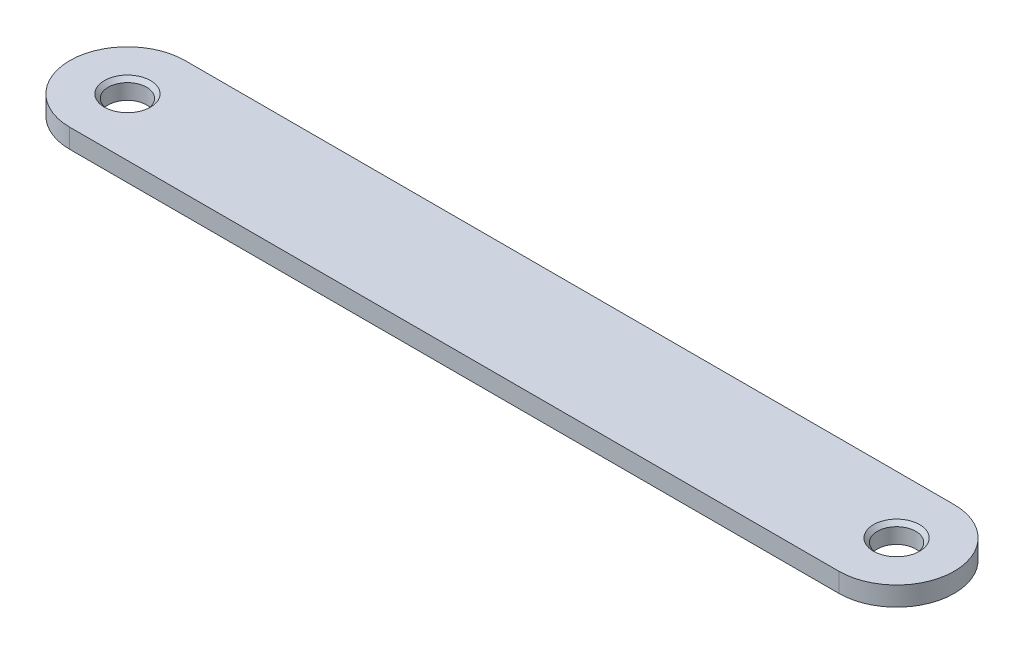
ISO-10303-21;
HEADER;
FILE_DESCRIPTION(('STEP AP214'),'2;1');
FILE_NAME('part.step','',(''),(''),'','','');
FILE_SCHEMA(('AUTOMOTIVE_DESIGN { 1 0 10303 214 1 1 1 1 }'));
ENDSEC;
DATA;
#1=APPLICATION_CONTEXT('core data for automotive mechanical design processes');
#2=APPLICATION_PROTOCOL_DEFINITION('international standard','automotive_design',2000,#1);
#3=PRODUCT_CONTEXT('',#1,'mechanical');
#4=PRODUCT('Part','Part','',(#3));
#5=PRODUCT_RELATED_PRODUCT_CATEGORY('part','',(#4));
#6=PRODUCT_DEFINITION_FORMATION('','',#4);
#7=PRODUCT_DEFINITION_CONTEXT('part definition',#1,'design');
#8=PRODUCT_DEFINITION('design','',#6,#7);
#9=PRODUCT_DEFINITION_SHAPE('','',#8);
#10=(LENGTH_UNIT() NAMED_UNIT(*) SI_UNIT(.MILLI.,.METRE.));
#11=(NAMED_UNIT(*) PLANE_ANGLE_UNIT() SI_UNIT($,.RADIAN.));
#12=(NAMED_UNIT(*) SI_UNIT($,.STERADIAN.) SOLID_ANGLE_UNIT());
#13=UNCERTAINTY_MEASURE_WITH_UNIT(LENGTH_MEASURE(1.E-05),#10,'distance_accuracy_value','');
#14=(GEOMETRIC_REPRESENTATION_CONTEXT(3) GLOBAL_UNCERTAINTY_ASSIGNED_CONTEXT((#13)) GLOBAL_UNIT_ASSIGNED_CONTEXT((#10,
#11,#12)) REPRESENTATION_CONTEXT('',''));
#15=CARTESIAN_POINT('',(0.,0.,0.));
#16=DIRECTION('',(0.,0.,1.));
#17=DIRECTION('',(1.,0.,0.));
#18=AXIS2_PLACEMENT_3D('',#15,#16,#17);
#19=CARTESIAN_POINT('',(0.,5.,0.));
#20=DIRECTION('',(0.,1.,0.));
#21=DIRECTION('',(0.,0.,1.));
#22=AXIS2_PLACEMENT_3D('',#19,#20,#21);
#23=PLANE('',#22);
#24=CARTESIAN_POINT('',(0.,5.,0.));
#25=DIRECTION('',(0.,1.,0.));
#26=DIRECTION('',(0.,0.,1.));
#27=AXIS2_PLACEMENT_3D('',#24,#25,#26);
#28=CIRCLE('',#27,6.00000000000003);
#29=CARTESIAN_POINT('',(0.,5.,6.00000000000003));
#30=VERTEX_POINT('',#29);
#31=EDGE_CURVE('E11',#30,#30,#28,.F.);
#32=ORIENTED_EDGE('',*,*,#31,.T.);
#33=EDGE_LOOP('',(#32));
#34=FACE_BOUND('',#33,.T.);
#35=CARTESIAN_POINT('',(200.,5.,0.));
#36=DIRECTION('',(0.,1.,0.));
#37=DIRECTION('',(0.,0.,1.));
#38=AXIS2_PLACEMENT_3D('',#35,#36,#37);
#39=CIRCLE('',#38,5.99999999999995);
#40=CARTESIAN_POINT('',(200.,5.,5.99999999999995));
#41=VERTEX_POINT('',#40);
#42=EDGE_CURVE('E121',#41,#41,#39,.F.);
#43=ORIENTED_EDGE('',*,*,#42,.T.);
#44=EDGE_LOOP('',(#43));
#45=FACE_BOUND('',#44,.T.);
#46=CARTESIAN_POINT('',(0.,5.,0.));
#47=DIRECTION('',(0.,1.,0.));
#48=DIRECTION('',(0.,0.,1.));
#49=AXIS2_PLACEMENT_3D('',#46,#47,#48);
#50=CIRCLE('',#49,15.);
#51=CARTESIAN_POINT('',(0.,5.,-15.));
#52=VERTEX_POINT('',#51);
#53=CARTESIAN_POINT('',(0.,5.,15.));
#54=VERTEX_POINT('',#53);
#55=EDGE_CURVE('E93',#52,#54,#50,.T.);
#56=ORIENTED_EDGE('',*,*,#55,.T.);
#57=DIRECTION('',(1.,0.,0.));
#58=VECTOR('',#57,1.);
#59=CARTESIAN_POINT('',(0.,5.,15.));
#60=LINE('',#59,#58);
#61=CARTESIAN_POINT('',(200.,5.,15.));
#62=VERTEX_POINT('',#61);
#63=EDGE_CURVE('E89',#54,#62,#60,.T.);
#64=ORIENTED_EDGE('',*,*,#63,.T.);
#65=CARTESIAN_POINT('',(200.,5.,0.));
#66=DIRECTION('',(0.,1.,0.));
#67=DIRECTION('',(0.,0.,1.));
#68=AXIS2_PLACEMENT_3D('',#65,#66,#67);
#69=CIRCLE('',#68,15.);
#70=CARTESIAN_POINT('',(200.,5.,-15.));
#71=VERTEX_POINT('',#70);
#72=EDGE_CURVE('E91',#62,#71,#69,.T.);
#73=ORIENTED_EDGE('',*,*,#72,.T.);
#74=DIRECTION('',(-1.,0.,0.));
#75=VECTOR('',#74,1.);
#76=CARTESIAN_POINT('',(0.,5.,-15.));
#77=LINE('',#76,#75);
#78=EDGE_CURVE('E58',#71,#52,#77,.T.);
#79=ORIENTED_EDGE('',*,*,#78,.T.);
#80=EDGE_LOOP('',(#56,#64,#73,#79));
#81=FACE_BOUND('',#80,.T.);
#82=ADVANCED_FACE('F41',(#34,#45,#81),#23,.T.);
#83=CARTESIAN_POINT('',(0.,0.,0.));
#84=DIRECTION('',(0.,1.,0.));
#85=DIRECTION('',(0.,0.,1.));
#86=AXIS2_PLACEMENT_3D('',#83,#84,#85);
#87=PLANE('',#86);
#88=CARTESIAN_POINT('',(0.,0.,0.));
#89=DIRECTION('',(0.,1.,0.));
#90=DIRECTION('',(0.,0.,1.));
#91=AXIS2_PLACEMENT_3D('',#88,#89,#90);
#92=CIRCLE('',#91,15.);
#93=CARTESIAN_POINT('',(0.,0.,-15.));
#94=VERTEX_POINT('',#93);
#95=CARTESIAN_POINT('',(0.,0.,15.));
#96=VERTEX_POINT('',#95);
#97=EDGE_CURVE('E108',#94,#96,#92,.T.);
#98=ORIENTED_EDGE('',*,*,#97,.F.);
#99=DIRECTION('',(-1.,0.,0.));
#100=VECTOR('',#99,1.);
#101=CARTESIAN_POINT('',(0.,0.,-15.));
#102=LINE('',#101,#100);
#103=CARTESIAN_POINT('',(200.,0.,-15.));
#104=VERTEX_POINT('',#103);
#105=EDGE_CURVE('E81',#104,#94,#102,.T.);
#106=ORIENTED_EDGE('',*,*,#105,.F.);
#107=CARTESIAN_POINT('',(200.,0.,0.));
#108=DIRECTION('',(0.,1.,0.));
#109=DIRECTION('',(0.,0.,1.));
#110=AXIS2_PLACEMENT_3D('',#107,#108,#109);
#111=CIRCLE('',#110,15.);
#112=CARTESIAN_POINT('',(200.,0.,15.));
#113=VERTEX_POINT('',#112);
#114=EDGE_CURVE('E75',#113,#104,#111,.T.);
#115=ORIENTED_EDGE('',*,*,#114,.F.);
#116=DIRECTION('',(1.,0.,0.));
#117=VECTOR('',#116,1.);
#118=CARTESIAN_POINT('',(0.,0.,15.));
#119=LINE('',#118,#117);
#120=EDGE_CURVE('E98',#96,#113,#119,.T.);
#121=ORIENTED_EDGE('',*,*,#120,.F.);
#122=EDGE_LOOP('',(#98,#106,#115,#121));
#123=FACE_BOUND('',#122,.T.);
#124=CARTESIAN_POINT('',(0.,0.,0.));
#125=DIRECTION('',(0.,1.,0.));
#126=DIRECTION('',(0.,0.,1.));
#127=AXIS2_PLACEMENT_3D('',#124,#125,#126);
#128=CIRCLE('',#127,5.);
#129=CARTESIAN_POINT('',(0.,0.,5.));
#130=VERTEX_POINT('',#129);
#131=EDGE_CURVE('E111',#130,#130,#128,.T.);
#132=ORIENTED_EDGE('',*,*,#131,.T.);
#133=EDGE_LOOP('',(#132));
#134=FACE_BOUND('',#133,.T.);
#135=CARTESIAN_POINT('',(200.,0.,0.));
#136=DIRECTION('',(0.,1.,0.));
#137=DIRECTION('',(0.,0.,1.));
#138=AXIS2_PLACEMENT_3D('',#135,#136,#137);
#139=CIRCLE('',#138,4.99999999999999);
#140=CARTESIAN_POINT('',(200.,0.,4.99999999999999));
#141=VERTEX_POINT('',#140);
#142=EDGE_CURVE('E171',#141,#141,#139,.T.);
#143=ORIENTED_EDGE('',*,*,#142,.T.);
#144=EDGE_LOOP('',(#143));
#145=FACE_BOUND('',#144,.T.);
#146=ADVANCED_FACE('F140',(#123,#134,#145),#87,.F.);
#147=CARTESIAN_POINT('',(0.,5.,0.));
#148=DIRECTION('',(0.,-1.,0.));
#149=DIRECTION('',(0.,0.,-1.));
#150=AXIS2_PLACEMENT_3D('',#147,#148,#149);
#151=CYLINDRICAL_SURFACE('',#150,15.);
#152=ORIENTED_EDGE('',*,*,#97,.T.);
#153=DIRECTION('',(0.,-1.,0.));
#154=VECTOR('',#153,1.);
#155=CARTESIAN_POINT('',(0.,5.,15.));
#156=LINE('',#155,#154);
#157=EDGE_CURVE('E99',#54,#96,#156,.T.);
#158=ORIENTED_EDGE('',*,*,#157,.F.);
#159=ORIENTED_EDGE('',*,*,#55,.F.);
#160=DIRECTION('',(0.,-1.,0.));
#161=VECTOR('',#160,1.);
#162=CARTESIAN_POINT('',(0.,5.,-15.));
#163=LINE('',#162,#161);
#164=EDGE_CURVE('E104',#52,#94,#163,.T.);
#165=ORIENTED_EDGE('',*,*,#164,.T.);
#166=EDGE_LOOP('',(#152,#158,#159,#165));
#167=FACE_BOUND('',#166,.T.);
#168=ADVANCED_FACE('F146',(#167),#151,.T.);
#169=CARTESIAN_POINT('',(0.,5.,15.));
#170=DIRECTION('',(0.,0.,-1.));
#171=DIRECTION('',(-1.,0.,0.));
#172=AXIS2_PLACEMENT_3D('',#169,#170,#171);
#173=PLANE('',#172);
#174=ORIENTED_EDGE('',*,*,#120,.T.);
#175=DIRECTION('',(0.,-1.,0.));
#176=VECTOR('',#175,1.);
#177=CARTESIAN_POINT('',(200.,5.,15.));
#178=LINE('',#177,#176);
#179=EDGE_CURVE('E96',#62,#113,#178,.T.);
#180=ORIENTED_EDGE('',*,*,#179,.F.);
#181=ORIENTED_EDGE('',*,*,#63,.F.);
#182=ORIENTED_EDGE('',*,*,#157,.T.);
#183=EDGE_LOOP('',(#174,#180,#181,#182));
#184=FACE_BOUND('',#183,.T.);
#185=ADVANCED_FACE('F97',(#184),#173,.F.);
#186=CARTESIAN_POINT('',(200.,5.,0.));
#187=DIRECTION('',(0.,-1.,0.));
#188=DIRECTION('',(0.,0.,-1.));
#189=AXIS2_PLACEMENT_3D('',#186,#187,#188);
#190=CYLINDRICAL_SURFACE('',#189,15.);
#191=ORIENTED_EDGE('',*,*,#114,.T.);
#192=DIRECTION('',(0.,-1.,0.));
#193=VECTOR('',#192,1.);
#194=CARTESIAN_POINT('',(200.,5.,-15.));
#195=LINE('',#194,#193);
#196=EDGE_CURVE('E100',#71,#104,#195,.T.);
#197=ORIENTED_EDGE('',*,*,#196,.F.);
#198=ORIENTED_EDGE('',*,*,#72,.F.);
#199=ORIENTED_EDGE('',*,*,#179,.T.);
#200=EDGE_LOOP('',(#191,#197,#198,#199));
#201=FACE_BOUND('',#200,.T.);
#202=ADVANCED_FACE('F102',(#201),#190,.T.);
#203=CARTESIAN_POINT('',(0.,5.,-15.));
#204=DIRECTION('',(0.,0.,1.));
#205=DIRECTION('',(1.,0.,0.));
#206=AXIS2_PLACEMENT_3D('',#203,#204,#205);
#207=PLANE('',#206);
#208=ORIENTED_EDGE('',*,*,#105,.T.);
#209=ORIENTED_EDGE('',*,*,#164,.F.);
#210=ORIENTED_EDGE('',*,*,#78,.F.);
#211=ORIENTED_EDGE('',*,*,#196,.T.);
#212=EDGE_LOOP('',(#208,#209,#210,#211));
#213=FACE_BOUND('',#212,.T.);
#214=ADVANCED_FACE('F153',(#213),#207,.F.);
#215=CARTESIAN_POINT('',(0.,5.,0.));
#216=DIRECTION('',(0.,-1.,0.));
#217=DIRECTION('',(0.,0.,-1.));
#218=AXIS2_PLACEMENT_3D('',#215,#216,#217);
#219=CYLINDRICAL_SURFACE('',#218,5.);
#220=CARTESIAN_POINT('',(0.,3.99999999999995,0.));
#221=DIRECTION('',(0.,1.,0.));
#222=DIRECTION('',(0.,0.,1.));
#223=AXIS2_PLACEMENT_3D('',#220,#221,#222);
#224=CIRCLE('',#223,5.);
#225=CARTESIAN_POINT('',(0.,3.99999999999995,5.));
#226=VERTEX_POINT('',#225);
#227=EDGE_CURVE('E50',#226,#226,#224,.T.);
#228=ORIENTED_EDGE('',*,*,#227,.T.);
#229=EDGE_LOOP('',(#228));
#230=FACE_BOUND('',#229,.T.);
#231=ORIENTED_EDGE('',*,*,#131,.F.);
#232=EDGE_LOOP('',(#231));
#233=FACE_BOUND('',#232,.T.);
#234=ADVANCED_FACE('F126',(#230,#233),#219,.F.);
#235=CARTESIAN_POINT('',(200.,5.,0.));
#236=DIRECTION('',(0.,-1.,0.));
#237=DIRECTION('',(0.,0.,-1.));
#238=AXIS2_PLACEMENT_3D('',#235,#236,#237);
#239=CYLINDRICAL_SURFACE('',#238,4.99999999999999);
#240=CARTESIAN_POINT('',(200.,4.00000000000002,0.));
#241=DIRECTION('',(0.,1.,0.));
#242=DIRECTION('',(0.,0.,1.));
#243=AXIS2_PLACEMENT_3D('',#240,#241,#242);
#244=CIRCLE('',#243,4.99999999999999);
#245=CARTESIAN_POINT('',(200.,4.00000000000002,4.99999999999999));
#246=VERTEX_POINT('',#245);
#247=EDGE_CURVE('E118',#246,#246,#244,.T.);
#248=ORIENTED_EDGE('',*,*,#247,.T.);
#249=EDGE_LOOP('',(#248));
#250=FACE_BOUND('',#249,.T.);
#251=ORIENTED_EDGE('',*,*,#142,.F.);
#252=EDGE_LOOP('',(#251));
#253=FACE_BOUND('',#252,.T.);
#254=ADVANCED_FACE('F136',(#250,#253),#239,.F.);
#255=CARTESIAN_POINT('',(200.,4.00000000000002,0.));
#256=DIRECTION('',(0.,1.,0.));
#257=DIRECTION('',(0.,0.,1.));
#258=AXIS2_PLACEMENT_3D('',#255,#256,#257);
#259=CONICAL_SURFACE('',#258,4.99999999999999,0.78539816339744);
#260=ORIENTED_EDGE('',*,*,#42,.F.);
#261=EDGE_LOOP('',(#260));
#262=FACE_BOUND('',#261,.T.);
#263=ORIENTED_EDGE('',*,*,#247,.F.);
#264=EDGE_LOOP('',(#263));
#265=FACE_BOUND('',#264,.T.);
#266=ADVANCED_FACE('F130',(#262,#265),#259,.F.);
#267=CARTESIAN_POINT('',(0.,3.99999999999995,0.));
#268=DIRECTION('',(0.,1.,0.));
#269=DIRECTION('',(0.,0.,1.));
#270=AXIS2_PLACEMENT_3D('',#267,#268,#269);
#271=CONICAL_SURFACE('',#270,5.,0.78539816339744);
#272=ORIENTED_EDGE('',*,*,#31,.F.);
#273=EDGE_LOOP('',(#272));
#274=FACE_BOUND('',#273,.T.);
#275=ORIENTED_EDGE('',*,*,#227,.F.);
#276=EDGE_LOOP('',(#275));
#277=FACE_BOUND('',#276,.T.);
#278=ADVANCED_FACE('F43',(#274,#277),#271,.F.);
#279=CLOSED_SHELL('',(#82,#146,#168,#185,#202,#214,#234,#254,#266,#278));
#280=MANIFOLD_SOLID_BREP('B2',#279);
#281=ADVANCED_BREP_SHAPE_REPRESENTATION('',(#18,#280),#14);
#282=SHAPE_DEFINITION_REPRESENTATION(#9,#281);
ENDSEC;
END-ISO-10303-21;
